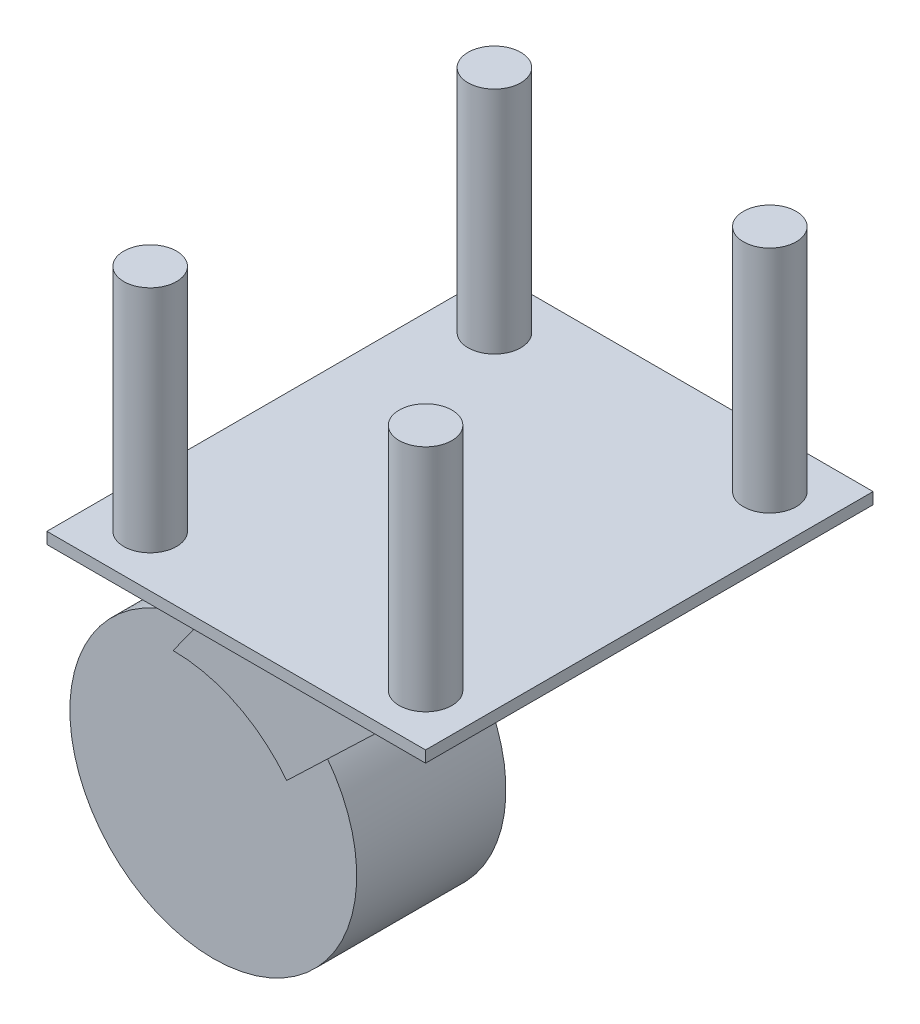
ISO-10303-21;
HEADER;
FILE_DESCRIPTION(('STEP AP214'),'2;1');
FILE_NAME('part.step','',(''),(''),'','','');
FILE_SCHEMA(('AUTOMOTIVE_DESIGN { 1 0 10303 214 1 1 1 1 }'));
ENDSEC;
DATA;
#1=APPLICATION_CONTEXT('core data for automotive mechanical design processes');
#2=APPLICATION_PROTOCOL_DEFINITION('international standard','automotive_design',2000,#1);
#3=PRODUCT_CONTEXT('',#1,'mechanical');
#4=PRODUCT('Part','Part','',(#3));
#5=PRODUCT_RELATED_PRODUCT_CATEGORY('part','',(#4));
#6=PRODUCT_DEFINITION_FORMATION('','',#4);
#7=PRODUCT_DEFINITION_CONTEXT('part definition',#1,'design');
#8=PRODUCT_DEFINITION('design','',#6,#7);
#9=PRODUCT_DEFINITION_SHAPE('','',#8);
#10=(LENGTH_UNIT() NAMED_UNIT(*) SI_UNIT(.MILLI.,.METRE.));
#11=(NAMED_UNIT(*) PLANE_ANGLE_UNIT() SI_UNIT($,.RADIAN.));
#12=(NAMED_UNIT(*) SI_UNIT($,.STERADIAN.) SOLID_ANGLE_UNIT());
#13=UNCERTAINTY_MEASURE_WITH_UNIT(LENGTH_MEASURE(1.E-05),#10,'distance_accuracy_value','');
#14=(GEOMETRIC_REPRESENTATION_CONTEXT(3) GLOBAL_UNCERTAINTY_ASSIGNED_CONTEXT((#13)) GLOBAL_UNIT_ASSIGNED_CONTEXT((#10,
#11,#12)) REPRESENTATION_CONTEXT('',''));
#15=CARTESIAN_POINT('',(0.,0.,0.));
#16=DIRECTION('',(0.,0.,1.));
#17=DIRECTION('',(1.,0.,0.));
#18=AXIS2_PLACEMENT_3D('',#15,#16,#17);
#19=CARTESIAN_POINT('',(-12.5,0.,10.));
#20=DIRECTION('',(0.978428694208119,0.20658482604053,0.));
#21=DIRECTION('',(-0.20658482604053,0.978428694208119,0.));
#22=AXIS2_PLACEMENT_3D('',#19,#20,#21);
#23=PLANE('',#22);
#24=DIRECTION('',(0.20658482604053,-0.978428694208119,0.));
#25=VECTOR('',#24,1.);
#26=CARTESIAN_POINT('',(-12.5,0.,10.));
#27=LINE('',#26,#25);
#28=CARTESIAN_POINT('',(-11.4443031093455,-5.,10.));
#29=VERTEX_POINT('',#28);
#30=CARTESIAN_POINT('',(-11.1118667837034,-6.57448756638845,10.));
#31=VERTEX_POINT('',#30);
#32=EDGE_CURVE('E227',#29,#31,#27,.T.);
#33=ORIENTED_EDGE('',*,*,#32,.F.);
#34=DIRECTION('',(0.,0.,-1.));
#35=VECTOR('',#34,1.);
#36=CARTESIAN_POINT('',(-11.4443031093455,-5.,10.));
#37=LINE('',#36,#35);
#38=CARTESIAN_POINT('',(-11.4443031093455,-5.,5.02771581748858));
#39=VERTEX_POINT('',#38);
#40=EDGE_CURVE('E161',#29,#39,#37,.T.);
#41=ORIENTED_EDGE('',*,*,#40,.T.);
#42=CARTESIAN_POINT('',(0.,-59.2025993003086,0.));
#43=DIRECTION('',(0.978428694208119,0.20658482604053,0.));
#44=DIRECTION('',(-0.20658482604053,0.978428694208119,0.));
#45=AXIS2_PLACEMENT_3D('',#42,#43,#44);
#46=ELLIPSE('',#45,60.5078322526341,12.5);
#47=CARTESIAN_POINT('',(-12.5,0.,0.));
#48=VERTEX_POINT('',#47);
#49=EDGE_CURVE('E175',#39,#48,#46,.F.);
#50=ORIENTED_EDGE('',*,*,#49,.T.);
#51=CARTESIAN_POINT('',(-11.4443031093455,-5.,-5.02771581748858));
#52=VERTEX_POINT('',#51);
#53=EDGE_CURVE('E185',#48,#52,#46,.F.);
#54=ORIENTED_EDGE('',*,*,#53,.T.);
#55=CARTESIAN_POINT('',(-11.4443031093455,-5.,-10.));
#56=VERTEX_POINT('',#55);
#57=EDGE_CURVE('E164',#52,#56,#37,.T.);
#58=ORIENTED_EDGE('',*,*,#57,.T.);
#59=DIRECTION('',(0.20658482604053,-0.978428694208119,0.));
#60=VECTOR('',#59,1.);
#61=CARTESIAN_POINT('',(-12.5,0.,-10.));
#62=LINE('',#61,#60);
#63=CARTESIAN_POINT('',(-11.1118667837034,-6.57448756638845,-10.));
#64=VERTEX_POINT('',#63);
#65=EDGE_CURVE('E239',#56,#64,#62,.T.);
#66=ORIENTED_EDGE('',*,*,#65,.T.);
#67=DIRECTION('',(0.,0.,-1.));
#68=VECTOR('',#67,1.);
#69=CARTESIAN_POINT('',(-11.1118667837034,-6.57448756638845,10.));
#70=LINE('',#69,#68);
#71=EDGE_CURVE('E260',#31,#64,#70,.T.);
#72=ORIENTED_EDGE('',*,*,#71,.F.);
#73=EDGE_LOOP('',(#33,#41,#50,#54,#58,#66,#72));
#74=FACE_BOUND('',#73,.T.);
#75=ADVANCED_FACE('F45',(#74),#23,.F.);
#76=CARTESIAN_POINT('',(-5.10453919940545,-16.8626015198959,10.));
#77=DIRECTION('',(-0.691725398953312,0.722160627868123,0.));
#78=DIRECTION('',(-0.722160627868123,-0.691725398953312,0.));
#79=AXIS2_PLACEMENT_3D('',#76,#77,#78);
#80=PLANE('',#79);
#81=CARTESIAN_POINT('',(0.,-11.9731914940334,0.));
#82=DIRECTION('',(-0.691725398953312,0.722160627868123,0.));
#83=DIRECTION('',(0.722160627868123,0.691725398953312,0.));
#84=AXIS2_PLACEMENT_3D('',#81,#82,#83);
#85=ELLIPSE('',#84,17.3091685113062,12.5);
#86=CARTESIAN_POINT('',(7.5,-4.78927659761335,-10.));
#87=VERTEX_POINT('',#86);
#88=CARTESIAN_POINT('',(12.5,0.,0.));
#89=VERTEX_POINT('',#88);
#90=EDGE_CURVE('E60',#87,#89,#85,.F.);
#91=ORIENTED_EDGE('',*,*,#90,.T.);
#92=CARTESIAN_POINT('',(7.5,-4.78927659761335,10.));
#93=VERTEX_POINT('',#92);
#94=EDGE_CURVE('E184',#89,#93,#85,.F.);
#95=ORIENTED_EDGE('',*,*,#94,.T.);
#96=DIRECTION('',(0.722160627868123,0.691725398953312,0.));
#97=VECTOR('',#96,1.);
#98=CARTESIAN_POINT('',(-5.10453919940545,-16.8626015198959,10.));
#99=LINE('',#98,#97);
#100=CARTESIAN_POINT('',(-5.10453919940545,-16.8626015198959,10.));
#101=VERTEX_POINT('',#100);
#102=EDGE_CURVE('E234',#101,#93,#99,.T.);
#103=ORIENTED_EDGE('',*,*,#102,.F.);
#104=DIRECTION('',(0.,0.,-1.));
#105=VECTOR('',#104,1.);
#106=CARTESIAN_POINT('',(-5.10453919940545,-16.8626015198959,10.));
#107=LINE('',#106,#105);
#108=CARTESIAN_POINT('',(-5.10453919940545,-16.8626015198959,6.5));
#109=VERTEX_POINT('',#108);
#110=EDGE_CURVE('E246',#101,#109,#107,.T.);
#111=ORIENTED_EDGE('',*,*,#110,.T.);
#112=CARTESIAN_POINT('',(-5.10453919940545,-16.8626015198959,-6.5));
#113=VERTEX_POINT('',#112);
#114=EDGE_CURVE('E251',#109,#113,#107,.T.);
#115=ORIENTED_EDGE('',*,*,#114,.T.);
#116=CARTESIAN_POINT('',(-5.10453919940545,-16.8626015198959,-10.));
#117=VERTEX_POINT('',#116);
#118=EDGE_CURVE('E237',#113,#117,#107,.T.);
#119=ORIENTED_EDGE('',*,*,#118,.T.);
#120=DIRECTION('',(0.722160627868123,0.691725398953312,0.));
#121=VECTOR('',#120,1.);
#122=CARTESIAN_POINT('',(-5.10453919940545,-16.8626015198959,-10.));
#123=LINE('',#122,#121);
#124=EDGE_CURVE('E230',#117,#87,#123,.T.);
#125=ORIENTED_EDGE('',*,*,#124,.T.);
#126=EDGE_LOOP('',(#91,#95,#103,#111,#115,#119,#125));
#127=FACE_BOUND('',#126,.T.);
#128=ADVANCED_FACE('F319',(#127),#80,.F.);
#129=CARTESIAN_POINT('',(-15.,-24.5,10.));
#130=DIRECTION('',(0.,0.,-1.));
#131=DIRECTION('',(-1.,0.,0.));
#132=AXIS2_PLACEMENT_3D('',#129,#130,#131);
#133=CYLINDRICAL_SURFACE('',#132,12.5);
#134=CARTESIAN_POINT('',(-15.,-24.5,6.5));
#135=DIRECTION('',(0.,0.,1.));
#136=DIRECTION('',(1.,0.,0.));
#137=AXIS2_PLACEMENT_3D('',#134,#135,#136);
#138=CIRCLE('',#137,12.5);
#139=CARTESIAN_POINT('',(-15.,-12.,6.5));
#140=VERTEX_POINT('',#139);
#141=EDGE_CURVE('E220',#109,#140,#138,.T.);
#142=ORIENTED_EDGE('',*,*,#141,.F.);
#143=ORIENTED_EDGE('',*,*,#110,.F.);
#144=CARTESIAN_POINT('',(-15.,-24.5,10.));
#145=DIRECTION('',(0.,0.,-1.));
#146=DIRECTION('',(1.,0.,0.));
#147=AXIS2_PLACEMENT_3D('',#144,#145,#146);
#148=CIRCLE('',#147,12.5);
#149=CARTESIAN_POINT('',(-15.,-12.,10.));
#150=VERTEX_POINT('',#149);
#151=EDGE_CURVE('E232',#150,#101,#148,.T.);
#152=ORIENTED_EDGE('',*,*,#151,.F.);
#153=DIRECTION('',(0.,0.,-1.));
#154=VECTOR('',#153,1.);
#155=CARTESIAN_POINT('',(-15.,-12.,10.));
#156=LINE('',#155,#154);
#157=EDGE_CURVE('E255',#150,#140,#156,.T.);
#158=ORIENTED_EDGE('',*,*,#157,.T.);
#159=EDGE_LOOP('',(#142,#143,#152,#158));
#160=FACE_BOUND('',#159,.T.);
#161=ADVANCED_FACE('F336',(#160),#133,.F.);
#162=CARTESIAN_POINT('',(16.5,1.,-19.5));
#163=DIRECTION('',(-1.,0.,0.));
#164=DIRECTION('',(0.,0.,1.));
#165=AXIS2_PLACEMENT_3D('',#162,#163,#164);
#166=PLANE('',#165);
#167=DIRECTION('',(0.,0.,-1.));
#168=VECTOR('',#167,1.);
#169=CARTESIAN_POINT('',(16.5,0.,-19.5));
#170=LINE('',#169,#168);
#171=CARTESIAN_POINT('',(16.5,0.,19.5));
#172=VERTEX_POINT('',#171);
#173=CARTESIAN_POINT('',(16.5,0.,-19.5));
#174=VERTEX_POINT('',#173);
#175=EDGE_CURVE('E261',#172,#174,#170,.T.);
#176=ORIENTED_EDGE('',*,*,#175,.T.);
#177=DIRECTION('',(0.,-1.,0.));
#178=VECTOR('',#177,1.);
#179=CARTESIAN_POINT('',(16.5,1.,-19.5));
#180=LINE('',#179,#178);
#181=CARTESIAN_POINT('',(16.5,1.,-19.5));
#182=VERTEX_POINT('',#181);
#183=EDGE_CURVE('E216',#182,#174,#180,.T.);
#184=ORIENTED_EDGE('',*,*,#183,.F.);
#185=DIRECTION('',(0.,0.,-1.));
#186=VECTOR('',#185,1.);
#187=CARTESIAN_POINT('',(16.5,1.,-19.5));
#188=LINE('',#187,#186);
#189=CARTESIAN_POINT('',(16.5,1.,19.5));
#190=VERTEX_POINT('',#189);
#191=EDGE_CURVE('E265',#190,#182,#188,.T.);
#192=ORIENTED_EDGE('',*,*,#191,.F.);
#193=DIRECTION('',(0.,-1.,0.));
#194=VECTOR('',#193,1.);
#195=CARTESIAN_POINT('',(16.5,1.,19.5));
#196=LINE('',#195,#194);
#197=EDGE_CURVE('E275',#190,#172,#196,.T.);
#198=ORIENTED_EDGE('',*,*,#197,.T.);
#199=EDGE_LOOP('',(#176,#184,#192,#198));
#200=FACE_BOUND('',#199,.T.);
#201=ADVANCED_FACE('F42',(#200),#166,.F.);
#202=CARTESIAN_POINT('',(-16.5,1.,-19.5));
#203=DIRECTION('',(0.,0.,1.));
#204=DIRECTION('',(1.,0.,0.));
#205=AXIS2_PLACEMENT_3D('',#202,#203,#204);
#206=PLANE('',#205);
#207=DIRECTION('',(-1.,0.,0.));
#208=VECTOR('',#207,1.);
#209=CARTESIAN_POINT('',(-16.5,0.,-19.5));
#210=LINE('',#209,#208);
#211=CARTESIAN_POINT('',(-16.5,0.,-19.5));
#212=VERTEX_POINT('',#211);
#213=EDGE_CURVE('E274',#174,#212,#210,.T.);
#214=ORIENTED_EDGE('',*,*,#213,.T.);
#215=DIRECTION('',(0.,-1.,0.));
#216=VECTOR('',#215,1.);
#217=CARTESIAN_POINT('',(-16.5,1.,-19.5));
#218=LINE('',#217,#216);
#219=CARTESIAN_POINT('',(-16.5,1.,-19.5));
#220=VERTEX_POINT('',#219);
#221=EDGE_CURVE('E281',#220,#212,#218,.T.);
#222=ORIENTED_EDGE('',*,*,#221,.F.);
#223=DIRECTION('',(-1.,0.,0.));
#224=VECTOR('',#223,1.);
#225=CARTESIAN_POINT('',(-16.5,1.,-19.5));
#226=LINE('',#225,#224);
#227=EDGE_CURVE('E264',#182,#220,#226,.T.);
#228=ORIENTED_EDGE('',*,*,#227,.F.);
#229=ORIENTED_EDGE('',*,*,#183,.T.);
#230=EDGE_LOOP('',(#214,#222,#228,#229));
#231=FACE_BOUND('',#230,.T.);
#232=ADVANCED_FACE('F359',(#231),#206,.F.);
#233=CARTESIAN_POINT('',(-16.5,1.,-19.5));
#234=DIRECTION('',(1.,0.,0.));
#235=DIRECTION('',(0.,0.,-1.));
#236=AXIS2_PLACEMENT_3D('',#233,#234,#235);
#237=PLANE('',#236);
#238=DIRECTION('',(0.,0.,1.));
#239=VECTOR('',#238,1.);
#240=CARTESIAN_POINT('',(-16.5,0.,-19.5));
#241=LINE('',#240,#239);
#242=CARTESIAN_POINT('',(-16.5,0.,19.5));
#243=VERTEX_POINT('',#242);
#244=EDGE_CURVE('E280',#212,#243,#241,.T.);
#245=ORIENTED_EDGE('',*,*,#244,.T.);
#246=DIRECTION('',(0.,-1.,0.));
#247=VECTOR('',#246,1.);
#248=CARTESIAN_POINT('',(-16.5,1.,19.5));
#249=LINE('',#248,#247);
#250=CARTESIAN_POINT('',(-16.5,1.,19.5));
#251=VERTEX_POINT('',#250);
#252=EDGE_CURVE('E285',#251,#243,#249,.T.);
#253=ORIENTED_EDGE('',*,*,#252,.F.);
#254=DIRECTION('',(0.,0.,1.));
#255=VECTOR('',#254,1.);
#256=CARTESIAN_POINT('',(-16.5,1.,-19.5));
#257=LINE('',#256,#255);
#258=EDGE_CURVE('E268',#220,#251,#257,.T.);
#259=ORIENTED_EDGE('',*,*,#258,.F.);
#260=ORIENTED_EDGE('',*,*,#221,.T.);
#261=EDGE_LOOP('',(#245,#253,#259,#260));
#262=FACE_BOUND('',#261,.T.);
#263=ADVANCED_FACE('F351',(#262),#237,.F.);
#264=CARTESIAN_POINT('',(-16.5,1.,19.5));
#265=DIRECTION('',(0.,0.,-1.));
#266=DIRECTION('',(-1.,0.,0.));
#267=AXIS2_PLACEMENT_3D('',#264,#265,#266);
#268=PLANE('',#267);
#269=DIRECTION('',(1.,0.,0.));
#270=VECTOR('',#269,1.);
#271=CARTESIAN_POINT('',(-16.5,0.,19.5));
#272=LINE('',#271,#270);
#273=EDGE_CURVE('E266',#243,#172,#272,.T.);
#274=ORIENTED_EDGE('',*,*,#273,.T.);
#275=ORIENTED_EDGE('',*,*,#197,.F.);
#276=DIRECTION('',(1.,0.,0.));
#277=VECTOR('',#276,1.);
#278=CARTESIAN_POINT('',(-16.5,1.,19.5));
#279=LINE('',#278,#277);
#280=EDGE_CURVE('E269',#251,#190,#279,.T.);
#281=ORIENTED_EDGE('',*,*,#280,.F.);
#282=ORIENTED_EDGE('',*,*,#252,.T.);
#283=EDGE_LOOP('',(#274,#275,#281,#282));
#284=FACE_BOUND('',#283,.T.);
#285=ADVANCED_FACE('F349',(#284),#268,.F.);
#286=CARTESIAN_POINT('',(0.,1.,0.));
#287=DIRECTION('',(0.,1.,0.));
#288=DIRECTION('',(0.,0.,1.));
#289=AXIS2_PLACEMENT_3D('',#286,#287,#288);
#290=PLANE('',#289);
#291=CARTESIAN_POINT('',(12.,1.,-15.));
#292=DIRECTION('',(0.,1.,0.));
#293=DIRECTION('',(0.,0.,1.));
#294=AXIS2_PLACEMENT_3D('',#291,#292,#293);
#295=CIRCLE('',#294,2.3);
#296=CARTESIAN_POINT('',(12.,1.,-12.7));
#297=VERTEX_POINT('',#296);
#298=EDGE_CURVE('E200',#297,#297,#295,.T.);
#299=ORIENTED_EDGE('',*,*,#298,.F.);
#300=EDGE_LOOP('',(#299));
#301=FACE_BOUND('',#300,.T.);
#302=CARTESIAN_POINT('',(-12.,1.,15.));
#303=DIRECTION('',(0.,1.,0.));
#304=DIRECTION('',(0.,0.,1.));
#305=AXIS2_PLACEMENT_3D('',#302,#303,#304);
#306=CIRCLE('',#305,2.3);
#307=CARTESIAN_POINT('',(-12.,1.,17.3));
#308=VERTEX_POINT('',#307);
#309=EDGE_CURVE('E194',#308,#308,#306,.T.);
#310=ORIENTED_EDGE('',*,*,#309,.F.);
#311=EDGE_LOOP('',(#310));
#312=FACE_BOUND('',#311,.T.);
#313=CARTESIAN_POINT('',(12.,1.,15.));
#314=DIRECTION('',(0.,1.,0.));
#315=DIRECTION('',(0.,0.,1.));
#316=AXIS2_PLACEMENT_3D('',#313,#314,#315);
#317=CIRCLE('',#316,2.3);
#318=CARTESIAN_POINT('',(12.,1.,17.3));
#319=VERTEX_POINT('',#318);
#320=EDGE_CURVE('E186',#319,#319,#317,.T.);
#321=ORIENTED_EDGE('',*,*,#320,.F.);
#322=EDGE_LOOP('',(#321));
#323=FACE_BOUND('',#322,.T.);
#324=CARTESIAN_POINT('',(-12.,1.,-15.));
#325=DIRECTION('',(0.,1.,0.));
#326=DIRECTION('',(0.,0.,1.));
#327=AXIS2_PLACEMENT_3D('',#324,#325,#326);
#328=CIRCLE('',#327,2.3);
#329=CARTESIAN_POINT('',(-12.,1.,-12.7));
#330=VERTEX_POINT('',#329);
#331=EDGE_CURVE('E191',#330,#330,#328,.T.);
#332=ORIENTED_EDGE('',*,*,#331,.F.);
#333=EDGE_LOOP('',(#332));
#334=FACE_BOUND('',#333,.T.);
#335=ORIENTED_EDGE('',*,*,#191,.T.);
#336=ORIENTED_EDGE('',*,*,#227,.T.);
#337=ORIENTED_EDGE('',*,*,#258,.T.);
#338=ORIENTED_EDGE('',*,*,#280,.T.);
#339=EDGE_LOOP('',(#335,#336,#337,#338));
#340=FACE_BOUND('',#339,.T.);
#341=ADVANCED_FACE('F347',(#301,#312,#323,#334,#340),#290,.T.);
#342=CARTESIAN_POINT('',(0.,0.,0.));
#343=DIRECTION('',(0.,1.,0.));
#344=DIRECTION('',(0.,0.,1.));
#345=AXIS2_PLACEMENT_3D('',#342,#343,#344);
#346=PLANE('',#345);
#347=CARTESIAN_POINT('',(0.,0.,0.));
#348=DIRECTION('',(0.,-1.,0.));
#349=DIRECTION('',(0.,0.,-1.));
#350=AXIS2_PLACEMENT_3D('',#347,#348,#349);
#351=CIRCLE('',#350,12.5);
#352=CARTESIAN_POINT('',(7.5,0.,10.));
#353=VERTEX_POINT('',#352);
#354=EDGE_CURVE('E313',#89,#353,#351,.T.);
#355=ORIENTED_EDGE('',*,*,#354,.F.);
#356=CARTESIAN_POINT('',(7.5,0.,-10.));
#357=VERTEX_POINT('',#356);
#358=EDGE_CURVE('E309',#357,#89,#351,.T.);
#359=ORIENTED_EDGE('',*,*,#358,.F.);
#360=DIRECTION('',(-1.,0.,0.));
#361=VECTOR('',#360,1.);
#362=CARTESIAN_POINT('',(-12.5,0.,-10.));
#363=LINE('',#362,#361);
#364=CARTESIAN_POINT('',(-7.5,0.,-10.));
#365=VERTEX_POINT('',#364);
#366=EDGE_CURVE('E219',#357,#365,#363,.T.);
#367=ORIENTED_EDGE('',*,*,#366,.T.);
#368=EDGE_CURVE('E64',#48,#365,#351,.T.);
#369=ORIENTED_EDGE('',*,*,#368,.F.);
#370=CARTESIAN_POINT('',(-7.5,0.,10.));
#371=VERTEX_POINT('',#370);
#372=EDGE_CURVE('E307',#371,#48,#351,.T.);
#373=ORIENTED_EDGE('',*,*,#372,.F.);
#374=DIRECTION('',(-1.,0.,0.));
#375=VECTOR('',#374,1.);
#376=CARTESIAN_POINT('',(-12.5,0.,10.));
#377=LINE('',#376,#375);
#378=EDGE_CURVE('E176',#353,#371,#377,.T.);
#379=ORIENTED_EDGE('',*,*,#378,.F.);
#380=EDGE_LOOP('',(#355,#359,#367,#369,#373,#379));
#381=FACE_BOUND('',#380,.T.);
#382=ORIENTED_EDGE('',*,*,#175,.F.);
#383=ORIENTED_EDGE('',*,*,#273,.F.);
#384=ORIENTED_EDGE('',*,*,#244,.F.);
#385=ORIENTED_EDGE('',*,*,#213,.F.);
#386=EDGE_LOOP('',(#382,#383,#384,#385));
#387=FACE_BOUND('',#386,.T.);
#388=ADVANCED_FACE('F303',(#381,#387),#346,.F.);
#389=CARTESIAN_POINT('',(-11.1118667837034,-6.57448756638845,10.));
#390=DIRECTION('',(0.812827816951461,-0.582504025728511,0.));
#391=DIRECTION('',(0.582504025728511,0.812827816951461,0.));
#392=AXIS2_PLACEMENT_3D('',#389,#390,#391);
#393=PLANE('',#392);
#394=DIRECTION('',(-0.582504025728511,-0.812827816951461,0.));
#395=VECTOR('',#394,1.);
#396=CARTESIAN_POINT('',(-11.1118667837034,-6.57448756638845,-10.));
#397=LINE('',#396,#395);
#398=CARTESIAN_POINT('',(-15.,-12.,-10.));
#399=VERTEX_POINT('',#398);
#400=EDGE_CURVE('E242',#64,#399,#397,.T.);
#401=ORIENTED_EDGE('',*,*,#400,.T.);
#402=CARTESIAN_POINT('',(-15.,-12.,-6.5));
#403=VERTEX_POINT('',#402);
#404=EDGE_CURVE('E252',#403,#399,#156,.T.);
#405=ORIENTED_EDGE('',*,*,#404,.F.);
#406=EDGE_CURVE('E256',#140,#403,#156,.T.);
#407=ORIENTED_EDGE('',*,*,#406,.F.);
#408=ORIENTED_EDGE('',*,*,#157,.F.);
#409=DIRECTION('',(-0.582504025728511,-0.812827816951461,0.));
#410=VECTOR('',#409,1.);
#411=CARTESIAN_POINT('',(-11.1118667837034,-6.57448756638845,10.));
#412=LINE('',#411,#410);
#413=EDGE_CURVE('E229',#31,#150,#412,.T.);
#414=ORIENTED_EDGE('',*,*,#413,.F.);
#415=ORIENTED_EDGE('',*,*,#71,.T.);
#416=EDGE_LOOP('',(#401,#405,#407,#408,#414,#415));
#417=FACE_BOUND('',#416,.T.);
#418=ADVANCED_FACE('F341',(#417),#393,.F.);
#419=ORIENTED_EDGE('',*,*,#118,.F.);
#420=CARTESIAN_POINT('',(-15.,-24.5,-6.5));
#421=DIRECTION('',(0.,0.,1.));
#422=DIRECTION('',(1.,0.,0.));
#423=AXIS2_PLACEMENT_3D('',#420,#421,#422);
#424=CIRCLE('',#423,12.5);
#425=EDGE_CURVE('E225',#113,#403,#424,.T.);
#426=ORIENTED_EDGE('',*,*,#425,.T.);
#427=ORIENTED_EDGE('',*,*,#404,.T.);
#428=CARTESIAN_POINT('',(-15.,-24.5,-10.));
#429=DIRECTION('',(0.,0.,-1.));
#430=DIRECTION('',(1.,0.,0.));
#431=AXIS2_PLACEMENT_3D('',#428,#429,#430);
#432=CIRCLE('',#431,12.5);
#433=EDGE_CURVE('E244',#399,#117,#432,.T.);
#434=ORIENTED_EDGE('',*,*,#433,.T.);
#435=EDGE_LOOP('',(#419,#426,#427,#434));
#436=FACE_BOUND('',#435,.T.);
#437=ADVANCED_FACE('F381',(#436),#133,.F.);
#438=CARTESIAN_POINT('',(-15.,-24.5,10.));
#439=DIRECTION('',(0.,0.,1.));
#440=DIRECTION('',(1.,0.,0.));
#441=AXIS2_PLACEMENT_3D('',#438,#439,#440);
#442=PLANE('',#441);
#443=DIRECTION('',(0.,1.,0.));
#444=VECTOR('',#443,1.);
#445=CARTESIAN_POINT('',(7.5,-5.,10.));
#446=LINE('',#445,#444);
#447=EDGE_CURVE('E178',#353,#93,#446,.F.);
#448=ORIENTED_EDGE('',*,*,#447,.F.);
#449=ORIENTED_EDGE('',*,*,#378,.T.);
#450=DIRECTION('',(0.,1.,0.));
#451=VECTOR('',#450,1.);
#452=CARTESIAN_POINT('',(-7.5,-5.,10.));
#453=LINE('',#452,#451);
#454=CARTESIAN_POINT('',(-7.5,-5.,10.));
#455=VERTEX_POINT('',#454);
#456=EDGE_CURVE('E166',#455,#371,#453,.T.);
#457=ORIENTED_EDGE('',*,*,#456,.F.);
#458=DIRECTION('',(1.,0.,0.));
#459=VECTOR('',#458,1.);
#460=CARTESIAN_POINT('',(-15.,-5.,10.));
#461=LINE('',#460,#459);
#462=EDGE_CURVE('E156',#29,#455,#461,.T.);
#463=ORIENTED_EDGE('',*,*,#462,.F.);
#464=ORIENTED_EDGE('',*,*,#32,.T.);
#465=ORIENTED_EDGE('',*,*,#413,.T.);
#466=ORIENTED_EDGE('',*,*,#151,.T.);
#467=ORIENTED_EDGE('',*,*,#102,.T.);
#468=EDGE_LOOP('',(#448,#449,#457,#463,#464,#465,#466,#467));
#469=FACE_BOUND('',#468,.T.);
#470=ADVANCED_FACE('F180',(#469),#442,.T.);
#471=CARTESIAN_POINT('',(-15.,-24.5,-10.));
#472=DIRECTION('',(0.,0.,1.));
#473=DIRECTION('',(1.,0.,0.));
#474=AXIS2_PLACEMENT_3D('',#471,#472,#473);
#475=PLANE('',#474);
#476=ORIENTED_EDGE('',*,*,#366,.F.);
#477=DIRECTION('',(0.,1.,0.));
#478=VECTOR('',#477,1.);
#479=CARTESIAN_POINT('',(7.5,-5.,-10.));
#480=LINE('',#479,#478);
#481=EDGE_CURVE('E12',#357,#87,#480,.F.);
#482=ORIENTED_EDGE('',*,*,#481,.T.);
#483=ORIENTED_EDGE('',*,*,#124,.F.);
#484=ORIENTED_EDGE('',*,*,#433,.F.);
#485=ORIENTED_EDGE('',*,*,#400,.F.);
#486=ORIENTED_EDGE('',*,*,#65,.F.);
#487=DIRECTION('',(1.,0.,0.));
#488=VECTOR('',#487,1.);
#489=CARTESIAN_POINT('',(-15.,-5.,-10.));
#490=LINE('',#489,#488);
#491=CARTESIAN_POINT('',(-7.5,-5.,-10.));
#492=VERTEX_POINT('',#491);
#493=EDGE_CURVE('E49',#56,#492,#490,.T.);
#494=ORIENTED_EDGE('',*,*,#493,.T.);
#495=DIRECTION('',(0.,1.,0.));
#496=VECTOR('',#495,1.);
#497=CARTESIAN_POINT('',(-7.5,-5.,-10.));
#498=LINE('',#497,#496);
#499=EDGE_CURVE('E205',#492,#365,#498,.T.);
#500=ORIENTED_EDGE('',*,*,#499,.T.);
#501=EDGE_LOOP('',(#476,#482,#483,#484,#485,#486,#494,#500));
#502=FACE_BOUND('',#501,.T.);
#503=ADVANCED_FACE('F294',(#502),#475,.F.);
#504=CARTESIAN_POINT('',(-15.,-24.5,6.5));
#505=DIRECTION('',(0.,0.,-1.));
#506=DIRECTION('',(-1.,0.,0.));
#507=AXIS2_PLACEMENT_3D('',#504,#505,#506);
#508=CYLINDRICAL_SURFACE('',#507,12.5);
#509=ORIENTED_EDGE('',*,*,#114,.F.);
#510=EDGE_CURVE('E222',#140,#109,#138,.T.);
#511=ORIENTED_EDGE('',*,*,#510,.F.);
#512=ORIENTED_EDGE('',*,*,#406,.T.);
#513=EDGE_CURVE('E213',#403,#113,#424,.T.);
#514=ORIENTED_EDGE('',*,*,#513,.T.);
#515=EDGE_LOOP('',(#509,#511,#512,#514));
#516=FACE_BOUND('',#515,.T.);
#517=ADVANCED_FACE('F399',(#516),#508,.T.);
#518=CARTESIAN_POINT('',(-15.,-24.5,6.5));
#519=DIRECTION('',(0.,0.,1.));
#520=DIRECTION('',(1.,0.,0.));
#521=AXIS2_PLACEMENT_3D('',#518,#519,#520);
#522=PLANE('',#521);
#523=ORIENTED_EDGE('',*,*,#141,.T.);
#524=ORIENTED_EDGE('',*,*,#510,.T.);
#525=EDGE_LOOP('',(#523,#524));
#526=FACE_BOUND('',#525,.T.);
#527=ADVANCED_FACE('F402',(#526),#522,.T.);
#528=CARTESIAN_POINT('',(-15.,-24.5,-6.5));
#529=DIRECTION('',(0.,0.,1.));
#530=DIRECTION('',(1.,0.,0.));
#531=AXIS2_PLACEMENT_3D('',#528,#529,#530);
#532=PLANE('',#531);
#533=ORIENTED_EDGE('',*,*,#425,.F.);
#534=ORIENTED_EDGE('',*,*,#513,.F.);
#535=EDGE_LOOP('',(#533,#534));
#536=FACE_BOUND('',#535,.T.);
#537=ADVANCED_FACE('F407',(#536),#532,.F.);
#538=CARTESIAN_POINT('',(-12.,21.,-15.));
#539=DIRECTION('',(0.,-1.,0.));
#540=DIRECTION('',(0.,0.,-1.));
#541=AXIS2_PLACEMENT_3D('',#538,#539,#540);
#542=CYLINDRICAL_SURFACE('',#541,2.3);
#543=CARTESIAN_POINT('',(-12.,21.,-15.));
#544=DIRECTION('',(0.,1.,0.));
#545=DIRECTION('',(0.,0.,1.));
#546=AXIS2_PLACEMENT_3D('',#543,#544,#545);
#547=CIRCLE('',#546,2.3);
#548=CARTESIAN_POINT('',(-12.,21.,-12.7));
#549=VERTEX_POINT('',#548);
#550=EDGE_CURVE('E206',#549,#549,#547,.T.);
#551=ORIENTED_EDGE('',*,*,#550,.F.);
#552=EDGE_LOOP('',(#551));
#553=FACE_BOUND('',#552,.T.);
#554=ORIENTED_EDGE('',*,*,#331,.T.);
#555=EDGE_LOOP('',(#554));
#556=FACE_BOUND('',#555,.T.);
#557=ADVANCED_FACE('F412',(#553,#556),#542,.T.);
#558=CARTESIAN_POINT('',(-12.,21.,-15.));
#559=DIRECTION('',(0.,1.,0.));
#560=DIRECTION('',(0.,0.,1.));
#561=AXIS2_PLACEMENT_3D('',#558,#559,#560);
#562=PLANE('',#561);
#563=ORIENTED_EDGE('',*,*,#550,.T.);
#564=EDGE_LOOP('',(#563));
#565=FACE_BOUND('',#564,.T.);
#566=ADVANCED_FACE('F466',(#565),#562,.T.);
#567=CARTESIAN_POINT('',(12.,21.,15.));
#568=DIRECTION('',(0.,-1.,0.));
#569=DIRECTION('',(0.,0.,-1.));
#570=AXIS2_PLACEMENT_3D('',#567,#568,#569);
#571=CYLINDRICAL_SURFACE('',#570,2.3);
#572=CARTESIAN_POINT('',(12.,21.,15.));
#573=DIRECTION('',(0.,1.,0.));
#574=DIRECTION('',(0.,0.,1.));
#575=AXIS2_PLACEMENT_3D('',#572,#573,#574);
#576=CIRCLE('',#575,2.3);
#577=CARTESIAN_POINT('',(12.,21.,17.3));
#578=VERTEX_POINT('',#577);
#579=EDGE_CURVE('E193',#578,#578,#576,.T.);
#580=ORIENTED_EDGE('',*,*,#579,.F.);
#581=EDGE_LOOP('',(#580));
#582=FACE_BOUND('',#581,.T.);
#583=ORIENTED_EDGE('',*,*,#320,.T.);
#584=EDGE_LOOP('',(#583));
#585=FACE_BOUND('',#584,.T.);
#586=ADVANCED_FACE('F461',(#582,#585),#571,.T.);
#587=CARTESIAN_POINT('',(12.,21.,15.));
#588=DIRECTION('',(0.,1.,0.));
#589=DIRECTION('',(0.,0.,1.));
#590=AXIS2_PLACEMENT_3D('',#587,#588,#589);
#591=PLANE('',#590);
#592=ORIENTED_EDGE('',*,*,#579,.T.);
#593=EDGE_LOOP('',(#592));
#594=FACE_BOUND('',#593,.T.);
#595=ADVANCED_FACE('F469',(#594),#591,.T.);
#596=CARTESIAN_POINT('',(-12.,21.,15.));
#597=DIRECTION('',(0.,-1.,0.));
#598=DIRECTION('',(0.,0.,-1.));
#599=AXIS2_PLACEMENT_3D('',#596,#597,#598);
#600=CYLINDRICAL_SURFACE('',#599,2.3);
#601=CARTESIAN_POINT('',(-12.,21.,15.));
#602=DIRECTION('',(0.,1.,0.));
#603=DIRECTION('',(0.,0.,1.));
#604=AXIS2_PLACEMENT_3D('',#601,#602,#603);
#605=CIRCLE('',#604,2.3);
#606=CARTESIAN_POINT('',(-12.,21.,17.3));
#607=VERTEX_POINT('',#606);
#608=EDGE_CURVE('E196',#607,#607,#605,.T.);
#609=ORIENTED_EDGE('',*,*,#608,.F.);
#610=EDGE_LOOP('',(#609));
#611=FACE_BOUND('',#610,.T.);
#612=ORIENTED_EDGE('',*,*,#309,.T.);
#613=EDGE_LOOP('',(#612));
#614=FACE_BOUND('',#613,.T.);
#615=ADVANCED_FACE('F471',(#611,#614),#600,.T.);
#616=CARTESIAN_POINT('',(-12.,21.,15.));
#617=DIRECTION('',(0.,1.,0.));
#618=DIRECTION('',(0.,0.,1.));
#619=AXIS2_PLACEMENT_3D('',#616,#617,#618);
#620=PLANE('',#619);
#621=ORIENTED_EDGE('',*,*,#608,.T.);
#622=EDGE_LOOP('',(#621));
#623=FACE_BOUND('',#622,.T.);
#624=ADVANCED_FACE('F476',(#623),#620,.T.);
#625=CARTESIAN_POINT('',(12.,21.,-15.));
#626=DIRECTION('',(0.,-1.,0.));
#627=DIRECTION('',(0.,0.,-1.));
#628=AXIS2_PLACEMENT_3D('',#625,#626,#627);
#629=CYLINDRICAL_SURFACE('',#628,2.3);
#630=CARTESIAN_POINT('',(12.,21.,-15.));
#631=DIRECTION('',(0.,1.,0.));
#632=DIRECTION('',(0.,0.,1.));
#633=AXIS2_PLACEMENT_3D('',#630,#631,#632);
#634=CIRCLE('',#633,2.3);
#635=CARTESIAN_POINT('',(12.,21.,-12.7));
#636=VERTEX_POINT('',#635);
#637=EDGE_CURVE('E201',#636,#636,#634,.T.);
#638=ORIENTED_EDGE('',*,*,#637,.F.);
#639=EDGE_LOOP('',(#638));
#640=FACE_BOUND('',#639,.T.);
#641=ORIENTED_EDGE('',*,*,#298,.T.);
#642=EDGE_LOOP('',(#641));
#643=FACE_BOUND('',#642,.T.);
#644=ADVANCED_FACE('F474',(#640,#643),#629,.T.);
#645=CARTESIAN_POINT('',(12.,21.,-15.));
#646=DIRECTION('',(0.,1.,0.));
#647=DIRECTION('',(0.,0.,1.));
#648=AXIS2_PLACEMENT_3D('',#645,#646,#647);
#649=PLANE('',#648);
#650=ORIENTED_EDGE('',*,*,#637,.T.);
#651=EDGE_LOOP('',(#650));
#652=FACE_BOUND('',#651,.T.);
#653=ADVANCED_FACE('F429',(#652),#649,.T.);
#654=CARTESIAN_POINT('',(0.,-5.,0.));
#655=DIRECTION('',(0.,1.,0.));
#656=DIRECTION('',(0.,0.,1.));
#657=AXIS2_PLACEMENT_3D('',#654,#655,#656);
#658=CYLINDRICAL_SURFACE('',#657,12.5);
#659=ORIENTED_EDGE('',*,*,#368,.T.);
#660=ORIENTED_EDGE('',*,*,#499,.F.);
#661=CARTESIAN_POINT('',(0.,-5.,0.));
#662=DIRECTION('',(0.,-1.,0.));
#663=DIRECTION('',(0.,0.,-1.));
#664=AXIS2_PLACEMENT_3D('',#661,#662,#663);
#665=CIRCLE('',#664,12.5);
#666=EDGE_CURVE('E173',#52,#492,#665,.T.);
#667=ORIENTED_EDGE('',*,*,#666,.F.);
#668=ORIENTED_EDGE('',*,*,#53,.F.);
#669=EDGE_LOOP('',(#659,#660,#667,#668));
#670=FACE_BOUND('',#669,.T.);
#671=ADVANCED_FACE('F304',(#670),#658,.T.);
#672=CARTESIAN_POINT('',(-5.5,-5.,0.));
#673=DIRECTION('',(0.,-1.,0.));
#674=DIRECTION('',(0.,0.,-1.));
#675=AXIS2_PLACEMENT_3D('',#672,#673,#674);
#676=PLANE('',#675);
#677=ORIENTED_EDGE('',*,*,#666,.T.);
#678=ORIENTED_EDGE('',*,*,#493,.F.);
#679=ORIENTED_EDGE('',*,*,#57,.F.);
#680=EDGE_LOOP('',(#677,#678,#679));
#681=FACE_BOUND('',#680,.T.);
#682=ADVANCED_FACE('F298',(#681),#676,.F.);
#683=ORIENTED_EDGE('',*,*,#481,.F.);
#684=ORIENTED_EDGE('',*,*,#358,.T.);
#685=ORIENTED_EDGE('',*,*,#90,.F.);
#686=EDGE_LOOP('',(#683,#684,#685));
#687=FACE_BOUND('',#686,.T.);
#688=ADVANCED_FACE('F324',(#687),#658,.T.);
#689=EDGE_CURVE('E157',#455,#39,#665,.T.);
#690=ORIENTED_EDGE('',*,*,#689,.F.);
#691=ORIENTED_EDGE('',*,*,#456,.T.);
#692=ORIENTED_EDGE('',*,*,#372,.T.);
#693=ORIENTED_EDGE('',*,*,#49,.F.);
#694=EDGE_LOOP('',(#690,#691,#692,#693));
#695=FACE_BOUND('',#694,.T.);
#696=ADVANCED_FACE('F169',(#695),#658,.T.);
#697=ORIENTED_EDGE('',*,*,#462,.T.);
#698=ORIENTED_EDGE('',*,*,#689,.T.);
#699=ORIENTED_EDGE('',*,*,#40,.F.);
#700=EDGE_LOOP('',(#697,#698,#699));
#701=FACE_BOUND('',#700,.T.);
#702=ADVANCED_FACE('F158',(#701),#676,.F.);
#703=ORIENTED_EDGE('',*,*,#447,.T.);
#704=ORIENTED_EDGE('',*,*,#94,.F.);
#705=ORIENTED_EDGE('',*,*,#354,.T.);
#706=EDGE_LOOP('',(#703,#704,#705));
#707=FACE_BOUND('',#706,.T.);
#708=ADVANCED_FACE('F314',(#707),#658,.T.);
#709=CLOSED_SHELL('',(#75,#128,#161,#201,#232,#263,#285,#341,#388,#418,#437,#470,#503,#517,#527,
#537,#557,#566,#586,#595,#615,#624,#644,#653,#671,#682,#688,#696,#702,#708));
#710=MANIFOLD_SOLID_BREP('B2',#709);
#711=ADVANCED_BREP_SHAPE_REPRESENTATION('',(#18,#710),#14);
#712=SHAPE_DEFINITION_REPRESENTATION(#9,#711);
ENDSEC;
END-ISO-10303-21;
